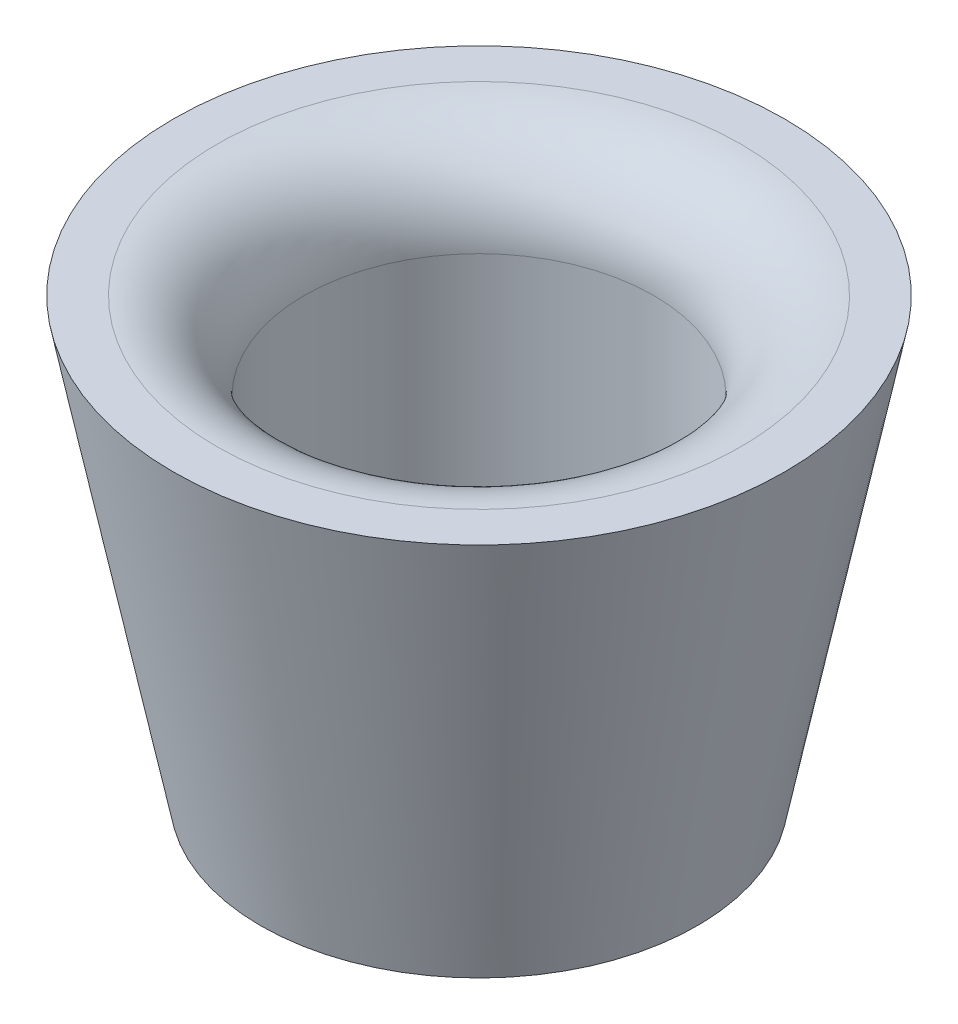
ISO-10303-21;
HEADER;
FILE_DESCRIPTION(('STEP AP214'),'2;1');
FILE_NAME('part.step','',(''),(''),'','','');
FILE_SCHEMA(('AUTOMOTIVE_DESIGN { 1 0 10303 214 1 1 1 1 }'));
ENDSEC;
DATA;
#1=APPLICATION_CONTEXT('core data for automotive mechanical design processes');
#2=APPLICATION_PROTOCOL_DEFINITION('international standard','automotive_design',2000,#1);
#3=PRODUCT_CONTEXT('',#1,'mechanical');
#4=PRODUCT('Part','Part','',(#3));
#5=PRODUCT_RELATED_PRODUCT_CATEGORY('part','',(#4));
#6=PRODUCT_DEFINITION_FORMATION('','',#4);
#7=PRODUCT_DEFINITION_CONTEXT('part definition',#1,'design');
#8=PRODUCT_DEFINITION('design','',#6,#7);
#9=PRODUCT_DEFINITION_SHAPE('','',#8);
#10=(LENGTH_UNIT() NAMED_UNIT(*) SI_UNIT(.MILLI.,.METRE.));
#11=(NAMED_UNIT(*) PLANE_ANGLE_UNIT() SI_UNIT($,.RADIAN.));
#12=(NAMED_UNIT(*) SI_UNIT($,.STERADIAN.) SOLID_ANGLE_UNIT());
#13=UNCERTAINTY_MEASURE_WITH_UNIT(LENGTH_MEASURE(1.E-05),#10,'distance_accuracy_value','');
#14=(GEOMETRIC_REPRESENTATION_CONTEXT(3) GLOBAL_UNCERTAINTY_ASSIGNED_CONTEXT((#13)) GLOBAL_UNIT_ASSIGNED_CONTEXT((#10,
#11,#12)) REPRESENTATION_CONTEXT('',''));
#15=CARTESIAN_POINT('',(0.,0.,0.));
#16=DIRECTION('',(0.,0.,1.));
#17=DIRECTION('',(1.,0.,0.));
#18=AXIS2_PLACEMENT_3D('',#15,#16,#17);
#19=CARTESIAN_POINT('',(5.,0.,0.));
#20=DIRECTION('',(0.,1.,0.));
#21=DIRECTION('',(0.,0.,1.));
#22=AXIS2_PLACEMENT_3D('',#19,#20,#21);
#23=PLANE('',#22);
#24=CARTESIAN_POINT('',(0.,0.,0.));
#25=DIRECTION('',(0.,1.,0.));
#26=DIRECTION('',(0.,0.,1.));
#27=AXIS2_PLACEMENT_3D('',#24,#25,#26);
#28=CIRCLE('',#27,5.);
#29=CARTESIAN_POINT('',(0.,0.,5.));
#30=VERTEX_POINT('',#29);
#31=EDGE_CURVE('E50',#30,#30,#28,.T.);
#32=ORIENTED_EDGE('',*,*,#31,.F.);
#33=EDGE_LOOP('',(#32));
#34=FACE_BOUND('',#33,.T.);
#35=CARTESIAN_POINT('',(0.,0.,0.));
#36=DIRECTION('',(0.,1.,0.));
#37=DIRECTION('',(0.,0.,1.));
#38=AXIS2_PLACEMENT_3D('',#35,#36,#37);
#39=CIRCLE('',#38,4.);
#40=CARTESIAN_POINT('',(0.,0.,4.));
#41=VERTEX_POINT('',#40);
#42=EDGE_CURVE('E41',#41,#41,#39,.T.);
#43=ORIENTED_EDGE('',*,*,#42,.T.);
#44=EDGE_LOOP('',(#43));
#45=FACE_BOUND('',#44,.T.);
#46=ADVANCED_FACE('F30',(#34,#45),#23,.F.);
#47=CARTESIAN_POINT('',(0.,15.75,0.));
#48=DIRECTION('',(0.,1.,0.));
#49=DIRECTION('',(0.,0.,1.));
#50=AXIS2_PLACEMENT_3D('',#47,#48,#49);
#51=CYLINDRICAL_SURFACE('',#50,4.);
#52=CARTESIAN_POINT('',(0.,8.,0.));
#53=DIRECTION('',(0.,-1.,0.));
#54=DIRECTION('',(0.,0.,-1.));
#55=AXIS2_PLACEMENT_3D('',#52,#53,#54);
#56=CIRCLE('',#55,4.);
#57=CARTESIAN_POINT('',(0.,8.,-4.));
#58=VERTEX_POINT('',#57);
#59=EDGE_CURVE('E37',#58,#58,#56,.F.);
#60=ORIENTED_EDGE('',*,*,#59,.T.);
#61=EDGE_LOOP('',(#60));
#62=FACE_BOUND('',#61,.T.);
#63=ORIENTED_EDGE('',*,*,#42,.F.);
#64=EDGE_LOOP('',(#63));
#65=FACE_BOUND('',#64,.T.);
#66=ADVANCED_FACE('F58',(#62,#65),#51,.F.);
#67=CARTESIAN_POINT('',(4.,10.,0.));
#68=DIRECTION('',(0.,-1.,0.));
#69=DIRECTION('',(0.,0.,-1.));
#70=AXIS2_PLACEMENT_3D('',#67,#68,#69);
#71=PLANE('',#70);
#72=CARTESIAN_POINT('',(0.,10.,0.));
#73=DIRECTION('',(0.,-1.,0.));
#74=DIRECTION('',(0.,0.,-1.));
#75=AXIS2_PLACEMENT_3D('',#72,#73,#74);
#76=CIRCLE('',#75,6.);
#77=CARTESIAN_POINT('',(0.,10.,-6.));
#78=VERTEX_POINT('',#77);
#79=EDGE_CURVE('E10',#78,#78,#76,.T.);
#80=ORIENTED_EDGE('',*,*,#79,.T.);
#81=EDGE_LOOP('',(#80));
#82=FACE_BOUND('',#81,.T.);
#83=CARTESIAN_POINT('',(0.,10.,0.));
#84=DIRECTION('',(0.,1.,0.));
#85=DIRECTION('',(0.,0.,1.));
#86=AXIS2_PLACEMENT_3D('',#83,#84,#85);
#87=CIRCLE('',#86,7.);
#88=CARTESIAN_POINT('',(0.,10.,7.));
#89=VERTEX_POINT('',#88);
#90=EDGE_CURVE('E45',#89,#89,#87,.T.);
#91=ORIENTED_EDGE('',*,*,#90,.T.);
#92=EDGE_LOOP('',(#91));
#93=FACE_BOUND('',#92,.T.);
#94=ADVANCED_FACE('F62',(#82,#93),#71,.F.);
#95=CARTESIAN_POINT('',(0.,0.,0.));
#96=DIRECTION('',(0.,1.,0.));
#97=DIRECTION('',(0.,0.,1.));
#98=AXIS2_PLACEMENT_3D('',#95,#96,#97);
#99=CONICAL_SURFACE('',#98,5.,0.197395559849881);
#100=ORIENTED_EDGE('',*,*,#90,.F.);
#101=EDGE_LOOP('',(#100));
#102=FACE_BOUND('',#101,.T.);
#103=ORIENTED_EDGE('',*,*,#31,.T.);
#104=EDGE_LOOP('',(#103));
#105=FACE_BOUND('',#104,.T.);
#106=ADVANCED_FACE('F54',(#102,#105),#99,.T.);
#107=CARTESIAN_POINT('',(0.,8.,0.));
#108=DIRECTION('',(0.,-1.,0.));
#109=DIRECTION('',(0.,0.,-1.));
#110=AXIS2_PLACEMENT_3D('',#107,#108,#109);
#111=TOROIDAL_SURFACE('',#110,6.,2.);
#112=ORIENTED_EDGE('',*,*,#79,.F.);
#113=EDGE_LOOP('',(#112));
#114=FACE_BOUND('',#113,.T.);
#115=ORIENTED_EDGE('',*,*,#59,.F.);
#116=EDGE_LOOP('',(#115));
#117=FACE_BOUND('',#116,.T.);
#118=ADVANCED_FACE('F32',(#114,#117),#111,.T.);
#119=CLOSED_SHELL('',(#46,#66,#94,#106,#118));
#120=MANIFOLD_SOLID_BREP('B2',#119);
#121=ADVANCED_BREP_SHAPE_REPRESENTATION('',(#18,#120),#14);
#122=SHAPE_DEFINITION_REPRESENTATION(#9,#121);
ENDSEC;
END-ISO-10303-21;
